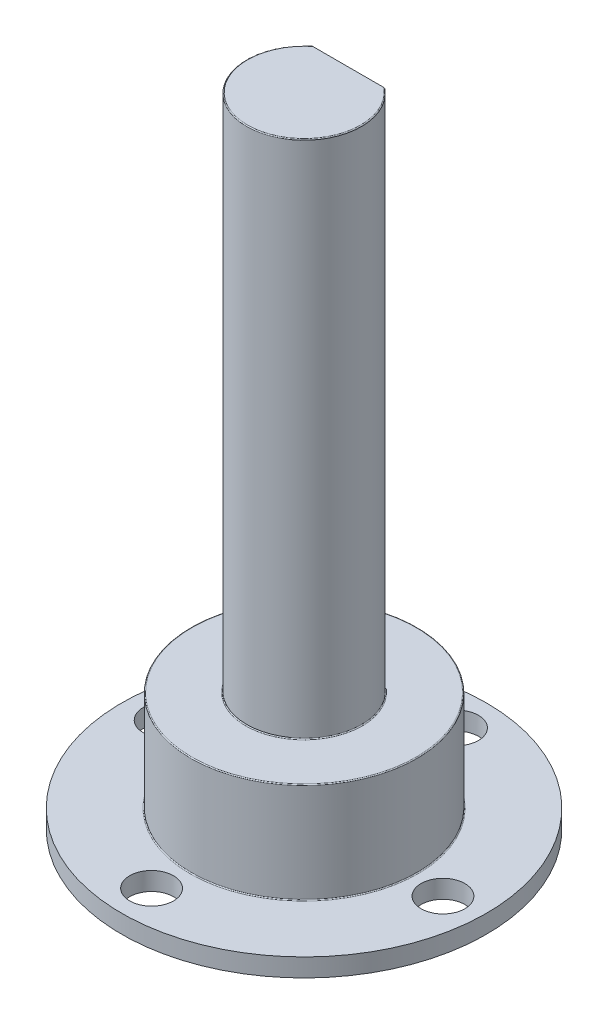
ISO-10303-21;
HEADER;
FILE_DESCRIPTION(('STEP AP214'),'2;1');
FILE_NAME('part.step','',(''),(''),'','','');
FILE_SCHEMA(('AUTOMOTIVE_DESIGN { 1 0 10303 214 1 1 1 1 }'));
ENDSEC;
DATA;
#1=APPLICATION_CONTEXT('core data for automotive mechanical design processes');
#2=APPLICATION_PROTOCOL_DEFINITION('international standard','automotive_design',2000,#1);
#3=PRODUCT_CONTEXT('',#1,'mechanical');
#4=PRODUCT('Part','Part','',(#3));
#5=PRODUCT_RELATED_PRODUCT_CATEGORY('part','',(#4));
#6=PRODUCT_DEFINITION_FORMATION('','',#4);
#7=PRODUCT_DEFINITION_CONTEXT('part definition',#1,'design');
#8=PRODUCT_DEFINITION('design','',#6,#7);
#9=PRODUCT_DEFINITION_SHAPE('','',#8);
#10=(LENGTH_UNIT() NAMED_UNIT(*) SI_UNIT(.MILLI.,.METRE.));
#11=(NAMED_UNIT(*) PLANE_ANGLE_UNIT() SI_UNIT($,.RADIAN.));
#12=(NAMED_UNIT(*) SI_UNIT($,.STERADIAN.) SOLID_ANGLE_UNIT());
#13=UNCERTAINTY_MEASURE_WITH_UNIT(LENGTH_MEASURE(1.E-05),#10,'distance_accuracy_value','');
#14=(GEOMETRIC_REPRESENTATION_CONTEXT(3) GLOBAL_UNCERTAINTY_ASSIGNED_CONTEXT((#13)) GLOBAL_UNIT_ASSIGNED_CONTEXT((#10,
#11,#12)) REPRESENTATION_CONTEXT('',''));
#15=CARTESIAN_POINT('',(0.,0.,0.));
#16=DIRECTION('',(0.,0.,1.));
#17=DIRECTION('',(1.,0.,0.));
#18=AXIS2_PLACEMENT_3D('',#15,#16,#17);
#19=CARTESIAN_POINT('',(0.,35.,0.));
#20=DIRECTION('',(0.,1.,0.));
#21=DIRECTION('',(0.,0.,1.));
#22=AXIS2_PLACEMENT_3D('',#19,#20,#21);
#23=PLANE('',#22);
#24=DIRECTION('',(1.,0.,0.));
#25=VECTOR('',#24,1.);
#26=CARTESIAN_POINT('',(-3.64134224162171,35.,-2.42190413345966));
#27=LINE('',#26,#25);
#28=CARTESIAN_POINT('',(-1.93504014643908,35.,-2.42190413345966));
#29=VERTEX_POINT('',#28);
#30=CARTESIAN_POINT('',(1.93504014643908,35.,-2.42190413345966));
#31=VERTEX_POINT('',#30);
#32=EDGE_CURVE('E196',#29,#31,#27,.T.);
#33=ORIENTED_EDGE('',*,*,#32,.F.);
#34=CARTESIAN_POINT('',(0.,35.,0.));
#35=DIRECTION('',(0.,1.,0.));
#36=DIRECTION('',(0.,0.,1.));
#37=AXIS2_PLACEMENT_3D('',#34,#35,#36);
#38=CIRCLE('',#37,3.09999999999999);
#39=EDGE_CURVE('E263',#29,#31,#38,.T.);
#40=ORIENTED_EDGE('',*,*,#39,.T.);
#41=EDGE_LOOP('',(#33,#40));
#42=FACE_BOUND('',#41,.T.);
#43=ADVANCED_FACE('F32',(#42),#23,.T.);
#44=CARTESIAN_POINT('',(0.,3.,0.));
#45=DIRECTION('',(0.,-1.,0.));
#46=DIRECTION('',(0.,0.,-1.));
#47=AXIS2_PLACEMENT_3D('',#44,#45,#46);
#48=CYLINDRICAL_SURFACE('',#47,3.14999999999999);
#49=DIRECTION('',(0.,-1.,0.));
#50=VECTOR('',#49,1.);
#51=CARTESIAN_POINT('',(2.01416989559743,3.,-2.42190413345966));
#52=LINE('',#51,#50);
#53=CARTESIAN_POINT('',(2.01416989559743,34.95,-2.42190413345966));
#54=VERTEX_POINT('',#53);
#55=CARTESIAN_POINT('',(2.01416989559743,6.55,-2.42190413345966));
#56=VERTEX_POINT('',#55);
#57=EDGE_CURVE('E90',#54,#56,#52,.T.);
#58=ORIENTED_EDGE('',*,*,#57,.F.);
#59=CARTESIAN_POINT('',(0.,34.95,0.));
#60=DIRECTION('',(0.,1.,0.));
#61=DIRECTION('',(0.,0.,1.));
#62=AXIS2_PLACEMENT_3D('',#59,#60,#61);
#63=CIRCLE('',#62,3.14999999999999);
#64=CARTESIAN_POINT('',(-2.01416989559743,34.95,-2.42190413345966));
#65=VERTEX_POINT('',#64);
#66=EDGE_CURVE('E88',#54,#65,#63,.F.);
#67=ORIENTED_EDGE('',*,*,#66,.T.);
#68=DIRECTION('',(0.,-1.,0.));
#69=VECTOR('',#68,1.);
#70=CARTESIAN_POINT('',(-2.01416989559743,3.,-2.42190413345966));
#71=LINE('',#70,#69);
#72=CARTESIAN_POINT('',(-2.01416989559743,6.55,-2.42190413345966));
#73=VERTEX_POINT('',#72);
#74=EDGE_CURVE('E76',#73,#65,#71,.F.);
#75=ORIENTED_EDGE('',*,*,#74,.F.);
#76=CARTESIAN_POINT('',(0.,6.55,0.));
#77=DIRECTION('',(0.,1.,0.));
#78=DIRECTION('',(0.,0.,1.));
#79=AXIS2_PLACEMENT_3D('',#76,#77,#78);
#80=CIRCLE('',#79,3.14999999999999);
#81=EDGE_CURVE('E85',#73,#56,#80,.T.);
#82=ORIENTED_EDGE('',*,*,#81,.T.);
#83=EDGE_LOOP('',(#58,#67,#75,#82));
#84=FACE_BOUND('',#83,.T.);
#85=ADVANCED_FACE('F84',(#84),#48,.T.);
#86=CARTESIAN_POINT('',(3.15,6.5,0.));
#87=DIRECTION('',(0.,1.,0.));
#88=DIRECTION('',(0.,0.,1.));
#89=AXIS2_PLACEMENT_3D('',#86,#87,#88);
#90=PLANE('',#89);
#91=CARTESIAN_POINT('',(0.,6.5,0.));
#92=DIRECTION('',(0.,1.,0.));
#93=DIRECTION('',(0.,0.,1.));
#94=AXIS2_PLACEMENT_3D('',#91,#92,#93);
#95=CIRCLE('',#94,6.15);
#96=CARTESIAN_POINT('',(0.,6.5,6.15));
#97=VERTEX_POINT('',#96);
#98=EDGE_CURVE('E264',#97,#97,#95,.T.);
#99=ORIENTED_EDGE('',*,*,#98,.T.);
#100=EDGE_LOOP('',(#99));
#101=FACE_BOUND('',#100,.T.);
#102=CARTESIAN_POINT('',(0.,6.5,0.));
#103=DIRECTION('',(0.,1.,0.));
#104=DIRECTION('',(0.,0.,1.));
#105=AXIS2_PLACEMENT_3D('',#102,#103,#104);
#106=CIRCLE('',#105,3.19999999999999);
#107=CARTESIAN_POINT('',(2.09150194079063,6.5,-2.42190413345966));
#108=VERTEX_POINT('',#107);
#109=CARTESIAN_POINT('',(-2.09150194079063,6.5,-2.42190413345966));
#110=VERTEX_POINT('',#109);
#111=EDGE_CURVE('E266',#108,#110,#106,.F.);
#112=ORIENTED_EDGE('',*,*,#111,.T.);
#113=DIRECTION('',(-1.,0.,0.));
#114=VECTOR('',#113,1.);
#115=CARTESIAN_POINT('',(-3.64134224162171,6.5,-2.42190413345966));
#116=LINE('',#115,#114);
#117=EDGE_CURVE('E52',#108,#110,#116,.T.);
#118=ORIENTED_EDGE('',*,*,#117,.F.);
#119=EDGE_LOOP('',(#112,#118));
#120=FACE_BOUND('',#119,.T.);
#121=ADVANCED_FACE('F152',(#101,#120),#90,.T.);
#122=CARTESIAN_POINT('',(0.,3.,0.));
#123=DIRECTION('',(0.,-1.,0.));
#124=DIRECTION('',(0.,0.,-1.));
#125=AXIS2_PLACEMENT_3D('',#122,#123,#124);
#126=CYLINDRICAL_SURFACE('',#125,6.2);
#127=CARTESIAN_POINT('',(0.,6.45,0.));
#128=DIRECTION('',(0.,1.,0.));
#129=DIRECTION('',(0.,0.,1.));
#130=AXIS2_PLACEMENT_3D('',#127,#128,#129);
#131=CIRCLE('',#130,6.2);
#132=CARTESIAN_POINT('',(0.,6.45,6.2));
#133=VERTEX_POINT('',#132);
#134=EDGE_CURVE('E272',#133,#133,#131,.F.);
#135=ORIENTED_EDGE('',*,*,#134,.T.);
#136=EDGE_LOOP('',(#135));
#137=FACE_BOUND('',#136,.T.);
#138=CARTESIAN_POINT('',(0.,1.05,0.));
#139=DIRECTION('',(0.,1.,0.));
#140=DIRECTION('',(0.,0.,1.));
#141=AXIS2_PLACEMENT_3D('',#138,#139,#140);
#142=CIRCLE('',#141,6.2);
#143=CARTESIAN_POINT('',(0.,1.05,6.2));
#144=VERTEX_POINT('',#143);
#145=EDGE_CURVE('E270',#144,#144,#142,.T.);
#146=ORIENTED_EDGE('',*,*,#145,.T.);
#147=EDGE_LOOP('',(#146));
#148=FACE_BOUND('',#147,.T.);
#149=ADVANCED_FACE('F158',(#137,#148),#126,.T.);
#150=CARTESIAN_POINT('',(6.2,1.,0.));
#151=DIRECTION('',(0.,1.,0.));
#152=DIRECTION('',(0.,0.,1.));
#153=AXIS2_PLACEMENT_3D('',#150,#151,#152);
#154=PLANE('',#153);
#155=CARTESIAN_POINT('',(0.,1.,0.));
#156=DIRECTION('',(0.,1.,0.));
#157=DIRECTION('',(0.,0.,1.));
#158=AXIS2_PLACEMENT_3D('',#155,#156,#157);
#159=CIRCLE('',#158,6.25);
#160=CARTESIAN_POINT('',(0.,1.,6.25));
#161=VERTEX_POINT('',#160);
#162=EDGE_CURVE('E80',#161,#161,#159,.F.);
#163=ORIENTED_EDGE('',*,*,#162,.T.);
#164=EDGE_LOOP('',(#163));
#165=FACE_BOUND('',#164,.T.);
#166=CARTESIAN_POINT('',(-7.99137872735473,1.,-0.371303159133185));
#167=DIRECTION('',(0.,1.,0.));
#168=DIRECTION('',(0.,0.,1.));
#169=AXIS2_PLACEMENT_3D('',#166,#167,#168);
#170=CIRCLE('',#169,1.2);
#171=CARTESIAN_POINT('',(-7.99137872735473,1.,0.828696840866815));
#172=VERTEX_POINT('',#171);
#173=EDGE_CURVE('E221',#172,#172,#170,.T.);
#174=ORIENTED_EDGE('',*,*,#173,.F.);
#175=EDGE_LOOP('',(#174));
#176=FACE_BOUND('',#175,.T.);
#177=CARTESIAN_POINT('',(-0.371303159133101,1.,7.99137872735473));
#178=DIRECTION('',(0.,1.,0.));
#179=DIRECTION('',(0.,0.,1.));
#180=AXIS2_PLACEMENT_3D('',#177,#178,#179);
#181=CIRCLE('',#180,1.2);
#182=CARTESIAN_POINT('',(-0.371303159133101,1.,9.19137872735473));
#183=VERTEX_POINT('',#182);
#184=EDGE_CURVE('E215',#183,#183,#181,.T.);
#185=ORIENTED_EDGE('',*,*,#184,.F.);
#186=EDGE_LOOP('',(#185));
#187=FACE_BOUND('',#186,.T.);
#188=CARTESIAN_POINT('',(7.99137872735473,1.,0.371303159133129));
#189=DIRECTION('',(0.,1.,0.));
#190=DIRECTION('',(0.,0.,1.));
#191=AXIS2_PLACEMENT_3D('',#188,#189,#190);
#192=CIRCLE('',#191,1.2);
#193=CARTESIAN_POINT('',(7.99137872735473,1.,1.57130315913313));
#194=VERTEX_POINT('',#193);
#195=EDGE_CURVE('E209',#194,#194,#192,.T.);
#196=ORIENTED_EDGE('',*,*,#195,.F.);
#197=EDGE_LOOP('',(#196));
#198=FACE_BOUND('',#197,.T.);
#199=CARTESIAN_POINT('',(0.371303159133101,1.,-7.99137872735473));
#200=DIRECTION('',(0.,1.,0.));
#201=DIRECTION('',(0.,0.,1.));
#202=AXIS2_PLACEMENT_3D('',#199,#200,#201);
#203=CIRCLE('',#202,1.2);
#204=CARTESIAN_POINT('',(0.371303159133101,1.,-6.79137872735473));
#205=VERTEX_POINT('',#204);
#206=EDGE_CURVE('E203',#205,#205,#203,.T.);
#207=ORIENTED_EDGE('',*,*,#206,.F.);
#208=EDGE_LOOP('',(#207));
#209=FACE_BOUND('',#208,.T.);
#210=CARTESIAN_POINT('',(0.,1.,0.));
#211=DIRECTION('',(0.,-1.,0.));
#212=DIRECTION('',(0.,0.,-1.));
#213=AXIS2_PLACEMENT_3D('',#210,#211,#212);
#214=CIRCLE('',#213,10.);
#215=CARTESIAN_POINT('',(0.,1.,-10.));
#216=VERTEX_POINT('',#215);
#217=EDGE_CURVE('E94',#216,#216,#214,.T.);
#218=ORIENTED_EDGE('',*,*,#217,.F.);
#219=EDGE_LOOP('',(#218));
#220=FACE_BOUND('',#219,.T.);
#221=ADVANCED_FACE('F162',(#165,#176,#187,#198,#209,#220),#154,.T.);
#222=CARTESIAN_POINT('',(0.,3.,0.));
#223=DIRECTION('',(0.,-1.,0.));
#224=DIRECTION('',(0.,0.,-1.));
#225=AXIS2_PLACEMENT_3D('',#222,#223,#224);
#226=CYLINDRICAL_SURFACE('',#225,10.);
#227=ORIENTED_EDGE('',*,*,#217,.T.);
#228=EDGE_LOOP('',(#227));
#229=FACE_BOUND('',#228,.T.);
#230=CARTESIAN_POINT('',(0.,0.,0.));
#231=DIRECTION('',(0.,-1.,0.));
#232=DIRECTION('',(0.,0.,-1.));
#233=AXIS2_PLACEMENT_3D('',#230,#231,#232);
#234=CIRCLE('',#233,10.);
#235=CARTESIAN_POINT('',(0.,0.,-10.));
#236=VERTEX_POINT('',#235);
#237=EDGE_CURVE('E99',#236,#236,#234,.T.);
#238=ORIENTED_EDGE('',*,*,#237,.F.);
#239=EDGE_LOOP('',(#238));
#240=FACE_BOUND('',#239,.T.);
#241=ADVANCED_FACE('F166',(#229,#240),#226,.T.);
#242=CARTESIAN_POINT('',(10.,0.,0.));
#243=DIRECTION('',(0.,-1.,0.));
#244=DIRECTION('',(0.,0.,-1.));
#245=AXIS2_PLACEMENT_3D('',#242,#243,#244);
#246=PLANE('',#245);
#247=CARTESIAN_POINT('',(-7.99137872735473,0.,-0.371303159133185));
#248=DIRECTION('',(0.,-1.,0.));
#249=DIRECTION('',(0.,0.,-1.));
#250=AXIS2_PLACEMENT_3D('',#247,#248,#249);
#251=CIRCLE('',#250,1.2);
#252=CARTESIAN_POINT('',(-7.99137872735473,0.,-1.57130315913318));
#253=VERTEX_POINT('',#252);
#254=EDGE_CURVE('E218',#253,#253,#251,.T.);
#255=ORIENTED_EDGE('',*,*,#254,.F.);
#256=EDGE_LOOP('',(#255));
#257=FACE_BOUND('',#256,.T.);
#258=CARTESIAN_POINT('',(-0.371303159133101,0.,7.99137872735473));
#259=DIRECTION('',(0.,-1.,0.));
#260=DIRECTION('',(0.,0.,-1.));
#261=AXIS2_PLACEMENT_3D('',#258,#259,#260);
#262=CIRCLE('',#261,1.2);
#263=CARTESIAN_POINT('',(-0.371303159133101,0.,6.79137872735473));
#264=VERTEX_POINT('',#263);
#265=EDGE_CURVE('E212',#264,#264,#262,.T.);
#266=ORIENTED_EDGE('',*,*,#265,.F.);
#267=EDGE_LOOP('',(#266));
#268=FACE_BOUND('',#267,.T.);
#269=CARTESIAN_POINT('',(7.99137872735473,0.,0.371303159133129));
#270=DIRECTION('',(0.,-1.,0.));
#271=DIRECTION('',(0.,0.,-1.));
#272=AXIS2_PLACEMENT_3D('',#269,#270,#271);
#273=CIRCLE('',#272,1.2);
#274=CARTESIAN_POINT('',(7.99137872735473,0.,-0.82869684086687));
#275=VERTEX_POINT('',#274);
#276=EDGE_CURVE('E206',#275,#275,#273,.T.);
#277=ORIENTED_EDGE('',*,*,#276,.F.);
#278=EDGE_LOOP('',(#277));
#279=FACE_BOUND('',#278,.T.);
#280=CARTESIAN_POINT('',(0.371303159133101,0.,-7.99137872735473));
#281=DIRECTION('',(0.,-1.,0.));
#282=DIRECTION('',(0.,0.,-1.));
#283=AXIS2_PLACEMENT_3D('',#280,#281,#282);
#284=CIRCLE('',#283,1.2);
#285=CARTESIAN_POINT('',(0.371303159133101,0.,-9.19137872735473));
#286=VERTEX_POINT('',#285);
#287=EDGE_CURVE('E199',#286,#286,#284,.T.);
#288=ORIENTED_EDGE('',*,*,#287,.F.);
#289=EDGE_LOOP('',(#288));
#290=FACE_BOUND('',#289,.T.);
#291=ORIENTED_EDGE('',*,*,#237,.T.);
#292=EDGE_LOOP('',(#291));
#293=FACE_BOUND('',#292,.T.);
#294=CARTESIAN_POINT('',(0.,0.,0.));
#295=DIRECTION('',(0.,-1.,0.));
#296=DIRECTION('',(0.,0.,-1.));
#297=AXIS2_PLACEMENT_3D('',#294,#295,#296);
#298=CIRCLE('',#297,4.5);
#299=CARTESIAN_POINT('',(0.,0.,-4.5));
#300=VERTEX_POINT('',#299);
#301=EDGE_CURVE('E184',#300,#300,#298,.T.);
#302=ORIENTED_EDGE('',*,*,#301,.F.);
#303=EDGE_LOOP('',(#302));
#304=FACE_BOUND('',#303,.T.);
#305=ADVANCED_FACE('F170',(#257,#268,#279,#290,#293,#304),#246,.T.);
#306=CARTESIAN_POINT('',(0.,3.,0.));
#307=DIRECTION('',(0.,-1.,0.));
#308=DIRECTION('',(0.,0.,-1.));
#309=AXIS2_PLACEMENT_3D('',#306,#307,#308);
#310=CYLINDRICAL_SURFACE('',#309,4.5);
#311=ORIENTED_EDGE('',*,*,#301,.T.);
#312=EDGE_LOOP('',(#311));
#313=FACE_BOUND('',#312,.T.);
#314=CARTESIAN_POINT('',(0.,3.,0.));
#315=DIRECTION('',(0.,-1.,0.));
#316=DIRECTION('',(0.,0.,-1.));
#317=AXIS2_PLACEMENT_3D('',#314,#315,#316);
#318=CIRCLE('',#317,4.5);
#319=CARTESIAN_POINT('',(0.,3.,-4.5));
#320=VERTEX_POINT('',#319);
#321=EDGE_CURVE('E89',#320,#320,#318,.T.);
#322=ORIENTED_EDGE('',*,*,#321,.F.);
#323=EDGE_LOOP('',(#322));
#324=FACE_BOUND('',#323,.T.);
#325=ADVANCED_FACE('F173',(#313,#324),#310,.F.);
#326=CARTESIAN_POINT('',(4.5,3.,0.));
#327=DIRECTION('',(0.,-1.,0.));
#328=DIRECTION('',(0.,0.,-1.));
#329=AXIS2_PLACEMENT_3D('',#326,#327,#328);
#330=PLANE('',#329);
#331=ORIENTED_EDGE('',*,*,#321,.T.);
#332=EDGE_LOOP('',(#331));
#333=FACE_BOUND('',#332,.T.);
#334=ADVANCED_FACE('F123',(#333),#330,.T.);
#335=CARTESIAN_POINT('',(-3.64134224162171,-0.222301771314597,-2.42190413345966));
#336=DIRECTION('',(0.,0.,1.));
#337=DIRECTION('',(1.,0.,0.));
#338=AXIS2_PLACEMENT_3D('',#335,#336,#337);
#339=PLANE('',#338);
#340=ORIENTED_EDGE('',*,*,#74,.T.);
#341=CARTESIAN_POINT('',(-2.01416989559743,34.95,-2.42190413345966));
#342=CARTESIAN_POINT('',(-2.01417590237611,34.9521216830641,-2.42190413345966));
#343=CARTESIAN_POINT('',(-2.0139591167237,34.9542362565048,-2.42190413345966));
#344=CARTESIAN_POINT('',(-2.01313385755974,34.9583653469993,-2.42190413345966));
#345=CARTESIAN_POINT('',(-2.01252956095125,34.9603806871485,-2.42190413345966));
#346=CARTESIAN_POINT('',(-2.01098410194976,34.9642657850124,-2.42190413345966));
#347=CARTESIAN_POINT('',(-2.0100442207675,34.9661360639363,-2.42190413345966));
#348=CARTESIAN_POINT('',(-2.00789099026721,34.9697159538891,-2.42190413345966));
#349=CARTESIAN_POINT('',(-2.00667687582768,34.9714250960574,-2.42190413345966));
#350=CARTESIAN_POINT('',(-2.00338506976664,34.9754672746997,-2.42190413345966));
#351=CARTESIAN_POINT('',(-2.00117643251854,34.9776934145825,-2.42190413345966));
#352=CARTESIAN_POINT('',(-1.99643926205853,34.9817710648431,-2.42190413345966));
#353=CARTESIAN_POINT('',(-1.99391010489921,34.9836218256981,-2.42190413345966));
#354=CARTESIAN_POINT('',(-1.98725433870056,34.9878621134625,-2.42190413345966));
#355=CARTESIAN_POINT('',(-1.98298472824471,34.9900262882537,-2.42190413345966));
#356=CARTESIAN_POINT('',(-1.97416034746739,34.9936763378202,-2.42190413345966));
#357=CARTESIAN_POINT('',(-1.96960467061182,34.9951599182598,-2.42190413345966));
#358=CARTESIAN_POINT('',(-1.96006551370823,34.9975952002509,-2.42190413345966));
#359=CARTESIAN_POINT('',(-1.95507274239812,34.99850978958,-2.42190413345966));
#360=CARTESIAN_POINT('',(-1.94506350299753,34.9997060938126,-2.42190413345966));
#361=CARTESIAN_POINT('',(-1.9400478224935,34.9999942970851,-2.42190413345966));
#362=CARTESIAN_POINT('',(-1.93504014643969,35.0000000000024,-2.42190413345966));
#363=B_SPLINE_CURVE_WITH_KNOTS('',3,(#341,#342,#343,#344,#345,#346,#347,#348,#349,#350,#351,
#352,#353,#354,#355,#356,#357,#358,#359,#360,#361,#362),.UNSPECIFIED.,.F.,.F.,(4,2,2,2,2,2,2,2,
2,2,4),(0.,0.0063427322688981,0.0126182211126525,0.0188700028781413,0.0251394476725735,
0.0344942343102392,0.0438675197383261,0.0581489993796919,0.0724782754563156,0.0876644527897452,
0.102692560360127),.UNSPECIFIED.);
#364=EDGE_CURVE('E109',#65,#29,#363,.T.);
#365=ORIENTED_EDGE('',*,*,#364,.T.);
#366=ORIENTED_EDGE('',*,*,#32,.T.);
#367=CARTESIAN_POINT('',(1.93504014643908,35.,-2.42190413345966));
#368=CARTESIAN_POINT('',(1.94188847956159,34.9999797110995,-2.42190413345966));
#369=CARTESIAN_POINT('',(1.94878601283452,34.9994465858052,-2.42190413345966));
#370=CARTESIAN_POINT('',(1.96246409628458,34.9971729364779,-2.42190413345966));
#371=CARTESIAN_POINT('',(1.96924200411268,34.9954169846787,-2.42190413345966));
#372=CARTESIAN_POINT('',(1.97919852531103,34.9916661012743,-2.42190413345966));
#373=CARTESIAN_POINT('',(1.98256612796617,34.9901750768464,-2.42190413345966));
#374=CARTESIAN_POINT('',(1.98906382882478,34.9867535648226,-2.42190413345966));
#375=CARTESIAN_POINT('',(1.99219464353366,34.984824480028,-2.42190413345966));
#376=CARTESIAN_POINT('',(1.99742140895631,34.9809695256451,-2.42190413345966));
#377=CARTESIAN_POINT('',(1.99959044883741,34.9791434441421,-2.42190413345966));
#378=CARTESIAN_POINT('',(2.00362038574403,34.9751743375611,-2.42190413345966));
#379=CARTESIAN_POINT('',(2.00548166137603,34.9730317081357,-2.42190413345966));
#380=CARTESIAN_POINT('',(2.00833837363689,34.9690311411295,-2.42190413345966));
#381=CARTESIAN_POINT('',(2.00943306007167,34.9672443976273,-2.42190413345966));
#382=CARTESIAN_POINT('',(2.01131803815088,34.9635193981071,-2.42190413345966));
#383=CARTESIAN_POINT('',(2.01210914155115,34.9615815630485,-2.42190413345966));
#384=CARTESIAN_POINT('',(2.01319125734559,34.9580408347422,-2.42190413345966));
#385=CARTESIAN_POINT('',(2.0135545565663,34.9564600043746,-2.42190413345966));
#386=CARTESIAN_POINT('',(2.0140456183808,34.9532537312903,-2.42190413345966));
#387=CARTESIAN_POINT('',(2.01417209676777,34.9516280935669,-2.42190413345966));
#388=CARTESIAN_POINT('',(2.01416989561042,34.950000000004,-2.42190413345966));
#389=B_SPLINE_CURVE_WITH_KNOTS('',3,(#367,#368,#369,#370,#371,#372,#373,#374,#375,#376,#377,
#378,#379,#380,#381,#382,#383,#384,#385,#386,#387,#388),.UNSPECIFIED.,.F.,.F.,(4,2,2,2,2,2,2,2,
2,2,4),(0.,0.0206100752579518,0.0414850024725495,0.0525079464908524,0.0634960774350997,
0.0719759123297852,0.0804452365862227,0.0867087405057873,0.0929553776568572,0.097804444598153,
0.102679731233967),.UNSPECIFIED.);
#390=EDGE_CURVE('E96',#31,#54,#389,.T.);
#391=ORIENTED_EDGE('',*,*,#390,.T.);
#392=ORIENTED_EDGE('',*,*,#57,.T.);
#393=CARTESIAN_POINT('',(2.01416989559743,6.55,-2.42190413345966));
#394=CARTESIAN_POINT('',(2.01416375080115,6.54787045020707,-2.42190413345966));
#395=CARTESIAN_POINT('',(2.01438224320209,6.54574829513669,-2.42190413345966));
#396=CARTESIAN_POINT('',(2.0152130590764,6.54160525846304,-2.42190413345966));
#397=CARTESIAN_POINT('',(2.01582109365644,6.53958352924039,-2.42190413345966));
#398=CARTESIAN_POINT('',(2.0173745935777,6.53568665609458,-2.42190413345966));
#399=CARTESIAN_POINT('',(2.01831872381317,6.53381096746484,-2.42190413345966));
#400=CARTESIAN_POINT('',(2.02048009728127,6.53021999117104,-2.42190413345966));
#401=CARTESIAN_POINT('',(2.02169812443661,6.52850518433883,-2.42190413345966));
#402=CARTESIAN_POINT('',(2.02501346901599,6.52442992543303,-2.42190413345966));
#403=CARTESIAN_POINT('',(2.02724483126496,6.52217878225275,-2.42190413345966));
#404=CARTESIAN_POINT('',(2.03203085084424,6.51805424754571,-2.42190413345966));
#405=CARTESIAN_POINT('',(2.03458616786284,6.51618164764608,-2.42190413345966));
#406=CARTESIAN_POINT('',(2.04127117938197,6.51191746104592,-2.42190413345966));
#407=CARTESIAN_POINT('',(2.04554083701177,6.5097460011517,-2.42190413345966));
#408=CARTESIAN_POINT('',(2.05436646202734,6.50608737505192,-2.42190413345966));
#409=CARTESIAN_POINT('',(2.05892319370601,6.50460213154385,-2.42190413345966));
#410=CARTESIAN_POINT('',(2.06813792009235,6.50226696922212,-2.42190413345966));
#411=CARTESIAN_POINT('',(2.07279413682753,6.50140990907361,-2.42190413345966));
#412=CARTESIAN_POINT('',(2.08213608659994,6.50028128122227,-2.42190413345966));
#413=CARTESIAN_POINT('',(2.08682119893016,6.50000462558101,-2.42190413345966));
#414=CARTESIAN_POINT('',(2.09150194079008,6.49999999999782,-2.42190413345966));
#415=B_SPLINE_CURVE_WITH_KNOTS('',3,(#393,#394,#395,#396,#397,#398,#399,#400,#401,#402,#403,
#404,#405,#406,#407,#408,#409,#410,#411,#412,#413,#414),.UNSPECIFIED.,.F.,.F.,(4,2,2,2,2,2,2,2,
2,2,4),(0.,0.00636574946126754,0.0126625885841999,0.0189346882720301,0.0252249731858348,
0.0346804766431199,0.0441555538549283,0.0584475397049342,0.0727793307309596,0.0869455545208342,
0.100987066475824),.UNSPECIFIED.);
#416=EDGE_CURVE('E11',#56,#108,#415,.T.);
#417=ORIENTED_EDGE('',*,*,#416,.T.);
#418=ORIENTED_EDGE('',*,*,#117,.T.);
#419=CARTESIAN_POINT('',(-2.09150194079063,6.5,-2.42190413345966));
#420=CARTESIAN_POINT('',(-2.08511409521598,6.50001621423212,-2.42190413345966));
#421=CARTESIAN_POINT('',(-2.07869471576393,6.50052648826963,-2.42190413345966));
#422=CARTESIAN_POINT('',(-2.06596628688382,6.50264746767663,-2.42190413345966));
#423=CARTESIAN_POINT('',(-2.05965943695205,6.50427110274127,-2.42190413345966));
#424=CARTESIAN_POINT('',(-2.04994238179784,6.50783661385341,-2.42190413345966));
#425=CARTESIAN_POINT('',(-2.04638855644224,6.50938696380156,-2.42190413345966));
#426=CARTESIAN_POINT('',(-2.03954033704539,6.51297116439011,-2.42190413345966));
#427=CARTESIAN_POINT('',(-2.03624510969249,6.51500336930857,-2.42190413345966));
#428=CARTESIAN_POINT('',(-2.03089811026372,6.51898165874706,-2.42190413345966));
#429=CARTESIAN_POINT('',(-2.02875209764491,6.52080047405265,-2.42190413345966));
#430=CARTESIAN_POINT('',(-2.02476096129705,6.52474643740301,-2.42190413345966));
#431=CARTESIAN_POINT('',(-2.02291549026289,6.52687322410733,-2.42190413345966));
#432=CARTESIAN_POINT('',(-2.02005767088339,6.53086533674747,-2.42190413345966));
#433=CARTESIAN_POINT('',(-2.01895231407341,6.53266373673204,-2.42190413345966));
#434=CARTESIAN_POINT('',(-2.01704820175915,6.53641359302878,-2.42190413345966));
#435=CARTESIAN_POINT('',(-2.01624860618061,6.53836461197203,-2.42190413345966));
#436=CARTESIAN_POINT('',(-2.01515663114382,6.54192537983839,-2.42190413345966));
#437=CARTESIAN_POINT('',(-2.01479043508984,6.54351250936921,-2.42190413345966));
#438=CARTESIAN_POINT('',(-2.01429526220415,6.5467321056509,-2.42190413345966));
#439=CARTESIAN_POINT('',(-2.01416762156092,6.54836477609222,-2.42190413345966));
#440=CARTESIAN_POINT('',(-2.01416989559007,6.54999999999774,-2.42190413345966));
#441=B_SPLINE_CURVE_WITH_KNOTS('',3,(#419,#420,#421,#422,#423,#424,#425,#426,#427,#428,#429,
#430,#431,#432,#433,#434,#435,#436,#437,#438,#439,#440),.UNSPECIFIED.,.F.,.F.,(4,2,2,2,2,2,2,2,
2,2,4),(0.,0.0191992509703685,0.0386253292767741,0.050227690052755,0.0617909809987001,
0.0702051651229716,0.078609555760556,0.0849194969029163,0.0912119748389982,0.0960812340216022,
0.100977685931163),.UNSPECIFIED.);
#442=EDGE_CURVE('E46',#110,#73,#441,.T.);
#443=ORIENTED_EDGE('',*,*,#442,.T.);
#444=EDGE_LOOP('',(#340,#365,#366,#391,#392,#417,#418,#443));
#445=FACE_BOUND('',#444,.T.);
#446=ADVANCED_FACE('F75',(#445),#339,.F.);
#447=CARTESIAN_POINT('',(0.371303159133101,1.,-7.99137872735473));
#448=DIRECTION('',(0.,1.,0.));
#449=DIRECTION('',(0.,0.,1.));
#450=AXIS2_PLACEMENT_3D('',#447,#448,#449);
#451=CYLINDRICAL_SURFACE('',#450,1.2);
#452=ORIENTED_EDGE('',*,*,#206,.T.);
#453=EDGE_LOOP('',(#452));
#454=FACE_BOUND('',#453,.T.);
#455=ORIENTED_EDGE('',*,*,#287,.T.);
#456=EDGE_LOOP('',(#455));
#457=FACE_BOUND('',#456,.T.);
#458=ADVANCED_FACE('F122',(#454,#457),#451,.F.);
#459=CARTESIAN_POINT('',(7.99137872735473,1.,0.371303159133129));
#460=DIRECTION('',(0.,1.,0.));
#461=DIRECTION('',(0.,0.,1.));
#462=AXIS2_PLACEMENT_3D('',#459,#460,#461);
#463=CYLINDRICAL_SURFACE('',#462,1.2);
#464=ORIENTED_EDGE('',*,*,#195,.T.);
#465=EDGE_LOOP('',(#464));
#466=FACE_BOUND('',#465,.T.);
#467=ORIENTED_EDGE('',*,*,#276,.T.);
#468=EDGE_LOOP('',(#467));
#469=FACE_BOUND('',#468,.T.);
#470=ADVANCED_FACE('F239',(#466,#469),#463,.F.);
#471=CARTESIAN_POINT('',(-0.371303159133101,1.,7.99137872735473));
#472=DIRECTION('',(0.,1.,0.));
#473=DIRECTION('',(0.,0.,1.));
#474=AXIS2_PLACEMENT_3D('',#471,#472,#473);
#475=CYLINDRICAL_SURFACE('',#474,1.2);
#476=ORIENTED_EDGE('',*,*,#184,.T.);
#477=EDGE_LOOP('',(#476));
#478=FACE_BOUND('',#477,.T.);
#479=ORIENTED_EDGE('',*,*,#265,.T.);
#480=EDGE_LOOP('',(#479));
#481=FACE_BOUND('',#480,.T.);
#482=ADVANCED_FACE('F245',(#478,#481),#475,.F.);
#483=CARTESIAN_POINT('',(-7.99137872735473,1.,-0.371303159133185));
#484=DIRECTION('',(0.,1.,0.));
#485=DIRECTION('',(0.,0.,1.));
#486=AXIS2_PLACEMENT_3D('',#483,#484,#485);
#487=CYLINDRICAL_SURFACE('',#486,1.2);
#488=ORIENTED_EDGE('',*,*,#173,.T.);
#489=EDGE_LOOP('',(#488));
#490=FACE_BOUND('',#489,.T.);
#491=ORIENTED_EDGE('',*,*,#254,.T.);
#492=EDGE_LOOP('',(#491));
#493=FACE_BOUND('',#492,.T.);
#494=ADVANCED_FACE('F225',(#490,#493),#487,.F.);
#495=CARTESIAN_POINT('',(0.,34.95,0.));
#496=DIRECTION('',(0.,1.,0.));
#497=DIRECTION('',(0.,0.,1.));
#498=AXIS2_PLACEMENT_3D('',#495,#496,#497);
#499=TOROIDAL_SURFACE('',#498,3.09999999999999,0.05);
#500=ORIENTED_EDGE('',*,*,#390,.F.);
#501=ORIENTED_EDGE('',*,*,#39,.F.);
#502=ORIENTED_EDGE('',*,*,#364,.F.);
#503=ORIENTED_EDGE('',*,*,#66,.F.);
#504=EDGE_LOOP('',(#500,#501,#502,#503));
#505=FACE_BOUND('',#504,.T.);
#506=ADVANCED_FACE('F115',(#505),#499,.T.);
#507=CARTESIAN_POINT('',(0.,6.55,0.));
#508=DIRECTION('',(0.,1.,0.));
#509=DIRECTION('',(0.,0.,1.));
#510=AXIS2_PLACEMENT_3D('',#507,#508,#509);
#511=TOROIDAL_SURFACE('',#510,3.19999999999999,0.05);
#512=ORIENTED_EDGE('',*,*,#416,.F.);
#513=ORIENTED_EDGE('',*,*,#81,.F.);
#514=ORIENTED_EDGE('',*,*,#442,.F.);
#515=ORIENTED_EDGE('',*,*,#111,.F.);
#516=EDGE_LOOP('',(#512,#513,#514,#515));
#517=FACE_BOUND('',#516,.T.);
#518=ADVANCED_FACE('F93',(#517),#511,.F.);
#519=CARTESIAN_POINT('',(0.,6.45,0.));
#520=DIRECTION('',(0.,1.,0.));
#521=DIRECTION('',(0.,0.,1.));
#522=AXIS2_PLACEMENT_3D('',#519,#520,#521);
#523=TOROIDAL_SURFACE('',#522,6.15,0.05);
#524=ORIENTED_EDGE('',*,*,#98,.F.);
#525=EDGE_LOOP('',(#524));
#526=FACE_BOUND('',#525,.T.);
#527=ORIENTED_EDGE('',*,*,#134,.F.);
#528=EDGE_LOOP('',(#527));
#529=FACE_BOUND('',#528,.T.);
#530=ADVANCED_FACE('F137',(#526,#529),#523,.T.);
#531=CARTESIAN_POINT('',(0.,1.05,0.));
#532=DIRECTION('',(0.,1.,0.));
#533=DIRECTION('',(0.,0.,1.));
#534=AXIS2_PLACEMENT_3D('',#531,#532,#533);
#535=TOROIDAL_SURFACE('',#534,6.25,0.05);
#536=ORIENTED_EDGE('',*,*,#145,.F.);
#537=EDGE_LOOP('',(#536));
#538=FACE_BOUND('',#537,.T.);
#539=ORIENTED_EDGE('',*,*,#162,.F.);
#540=EDGE_LOOP('',(#539));
#541=FACE_BOUND('',#540,.T.);
#542=ADVANCED_FACE('F34',(#538,#541),#535,.F.);
#543=CLOSED_SHELL('',(#43,#85,#121,#149,#221,#241,#305,#325,#334,#446,#458,#470,#482,#494,#506,
#518,#530,#542));
#544=MANIFOLD_SOLID_BREP('B2',#543);
#545=ADVANCED_BREP_SHAPE_REPRESENTATION('',(#18,#544),#14);
#546=SHAPE_DEFINITION_REPRESENTATION(#9,#545);
ENDSEC;
END-ISO-10303-21;
